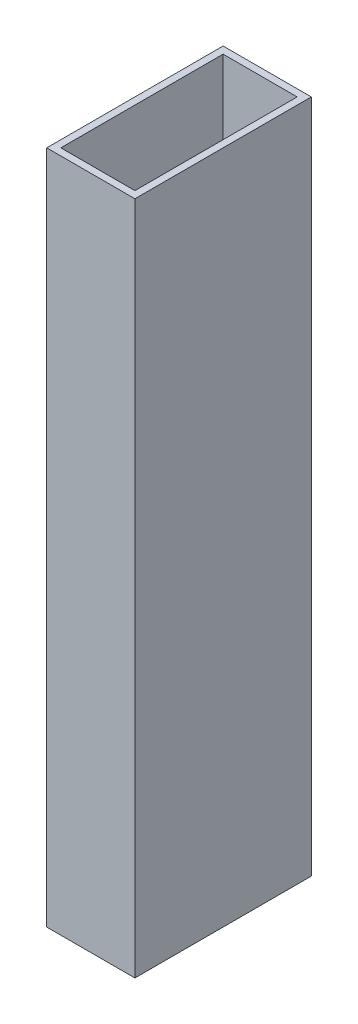
ISO-10303-21;
HEADER;
FILE_DESCRIPTION(('STEP AP214'),'2;1');
FILE_NAME('part.step','',(''),(''),'','','');
FILE_SCHEMA(('AUTOMOTIVE_DESIGN { 1 0 10303 214 1 1 1 1 }'));
ENDSEC;
DATA;
#1=APPLICATION_CONTEXT('core data for automotive mechanical design processes');
#2=APPLICATION_PROTOCOL_DEFINITION('international standard','automotive_design',2000,#1);
#3=PRODUCT_CONTEXT('',#1,'mechanical');
#4=PRODUCT('Part','Part','',(#3));
#5=PRODUCT_RELATED_PRODUCT_CATEGORY('part','',(#4));
#6=PRODUCT_DEFINITION_FORMATION('','',#4);
#7=PRODUCT_DEFINITION_CONTEXT('part definition',#1,'design');
#8=PRODUCT_DEFINITION('design','',#6,#7);
#9=PRODUCT_DEFINITION_SHAPE('','',#8);
#10=(LENGTH_UNIT() NAMED_UNIT(*) SI_UNIT(.MILLI.,.METRE.));
#11=(NAMED_UNIT(*) PLANE_ANGLE_UNIT() SI_UNIT($,.RADIAN.));
#12=(NAMED_UNIT(*) SI_UNIT($,.STERADIAN.) SOLID_ANGLE_UNIT());
#13=UNCERTAINTY_MEASURE_WITH_UNIT(LENGTH_MEASURE(1.E-05),#10,'distance_accuracy_value','');
#14=(GEOMETRIC_REPRESENTATION_CONTEXT(3) GLOBAL_UNCERTAINTY_ASSIGNED_CONTEXT((#13)) GLOBAL_UNIT_ASSIGNED_CONTEXT((#10,
#11,#12)) REPRESENTATION_CONTEXT('',''));
#15=CARTESIAN_POINT('',(0.,0.,0.));
#16=DIRECTION('',(0.,0.,1.));
#17=DIRECTION('',(1.,0.,0.));
#18=AXIS2_PLACEMENT_3D('',#15,#16,#17);
#19=CARTESIAN_POINT('',(281.510652388512,-429.299072168843,-866.486147986318));
#20=DIRECTION('',(-1.,0.,0.));
#21=DIRECTION('',(0.,0.,1.));
#22=AXIS2_PLACEMENT_3D('',#19,#20,#21);
#23=PLANE('',#22);
#24=DIRECTION('',(0.,1.,0.));
#25=VECTOR('',#24,1.);
#26=CARTESIAN_POINT('',(281.510652388512,-429.299072168843,-916.486147986319));
#27=LINE('',#26,#25);
#28=CARTESIAN_POINT('',(281.510652388512,-611.90552333629,-916.486147986319));
#29=VERTEX_POINT('',#28);
#30=CARTESIAN_POINT('',(281.510652388512,-229.299072168843,-916.486147986319));
#31=VERTEX_POINT('',#30);
#32=EDGE_CURVE('E156',#29,#31,#27,.T.);
#33=ORIENTED_EDGE('',*,*,#32,.T.);
#34=DIRECTION('',(0.,0.,-1.));
#35=VECTOR('',#34,1.);
#36=CARTESIAN_POINT('',(281.510652388512,-229.299072168843,-866.486147986318));
#37=LINE('',#36,#35);
#38=CARTESIAN_POINT('',(281.510652388512,-229.299072168843,-816.486147986318));
#39=VERTEX_POINT('',#38);
#40=EDGE_CURVE('E143',#31,#39,#37,.F.);
#41=ORIENTED_EDGE('',*,*,#40,.T.);
#42=DIRECTION('',(0.,1.,0.));
#43=VECTOR('',#42,1.);
#44=CARTESIAN_POINT('',(281.510652388512,-429.299072168843,-816.486147986318));
#45=LINE('',#44,#43);
#46=CARTESIAN_POINT('',(281.510652388512,-611.90552333629,-816.486147986318));
#47=VERTEX_POINT('',#46);
#48=EDGE_CURVE('E91',#47,#39,#45,.T.);
#49=ORIENTED_EDGE('',*,*,#48,.F.);
#50=DIRECTION('',(0.,0.,1.));
#51=VECTOR('',#50,1.);
#52=CARTESIAN_POINT('',(281.510652388512,-611.90552333629,-866.486147986318));
#53=LINE('',#52,#51);
#54=EDGE_CURVE('E108',#47,#29,#53,.F.);
#55=ORIENTED_EDGE('',*,*,#54,.T.);
#56=EDGE_LOOP('',(#33,#41,#49,#55));
#57=FACE_BOUND('',#56,.T.);
#58=ADVANCED_FACE('F17',(#57),#23,.F.);
#59=CARTESIAN_POINT('',(256.510652388512,-429.299072168843,-912.48614798632));
#60=DIRECTION('',(0.,0.,1.));
#61=DIRECTION('',(1.,0.,0.));
#62=AXIS2_PLACEMENT_3D('',#59,#60,#61);
#63=PLANE('',#62);
#64=DIRECTION('',(0.,1.,0.));
#65=VECTOR('',#64,1.);
#66=CARTESIAN_POINT('',(235.510652388511,-429.299072168843,-912.48614798632));
#67=LINE('',#66,#65);
#68=CARTESIAN_POINT('',(235.510652388511,-611.90552333629,-912.48614798632));
#69=VERTEX_POINT('',#68);
#70=CARTESIAN_POINT('',(235.510652388511,-229.299072168843,-912.48614798632));
#71=VERTEX_POINT('',#70);
#72=EDGE_CURVE('E20',#69,#71,#67,.T.);
#73=ORIENTED_EDGE('',*,*,#72,.F.);
#74=DIRECTION('',(1.,0.,0.));
#75=VECTOR('',#74,1.);
#76=CARTESIAN_POINT('',(256.510652388512,-611.90552333629,-912.48614798632));
#77=LINE('',#76,#75);
#78=CARTESIAN_POINT('',(277.510652388512,-611.90552333629,-912.48614798632));
#79=VERTEX_POINT('',#78);
#80=EDGE_CURVE('E99',#69,#79,#77,.T.);
#81=ORIENTED_EDGE('',*,*,#80,.T.);
#82=DIRECTION('',(0.,1.,0.));
#83=VECTOR('',#82,1.);
#84=CARTESIAN_POINT('',(277.510652388512,-429.299072168843,-912.48614798632));
#85=LINE('',#84,#83);
#86=CARTESIAN_POINT('',(277.510652388512,-229.299072168843,-912.48614798632));
#87=VERTEX_POINT('',#86);
#88=EDGE_CURVE('E81',#87,#79,#85,.F.);
#89=ORIENTED_EDGE('',*,*,#88,.F.);
#90=DIRECTION('',(1.,0.,0.));
#91=VECTOR('',#90,1.);
#92=CARTESIAN_POINT('',(256.510652388512,-229.299072168843,-912.48614798632));
#93=LINE('',#92,#91);
#94=EDGE_CURVE('E139',#87,#71,#93,.F.);
#95=ORIENTED_EDGE('',*,*,#94,.T.);
#96=EDGE_LOOP('',(#73,#81,#89,#95));
#97=FACE_BOUND('',#96,.T.);
#98=ADVANCED_FACE('F105',(#97),#63,.T.);
#99=CARTESIAN_POINT('',(235.510652388511,-429.299072168843,-866.486147986318));
#100=DIRECTION('',(1.,0.,0.));
#101=DIRECTION('',(0.,0.,-1.));
#102=AXIS2_PLACEMENT_3D('',#99,#100,#101);
#103=PLANE('',#102);
#104=DIRECTION('',(0.,0.,1.));
#105=VECTOR('',#104,1.);
#106=CARTESIAN_POINT('',(235.510652388511,-611.90552333629,-866.486147986318));
#107=LINE('',#106,#105);
#108=CARTESIAN_POINT('',(235.510652388511,-611.90552333629,-820.486147986319));
#109=VERTEX_POINT('',#108);
#110=EDGE_CURVE('E135',#109,#69,#107,.F.);
#111=ORIENTED_EDGE('',*,*,#110,.T.);
#112=ORIENTED_EDGE('',*,*,#72,.T.);
#113=DIRECTION('',(0.,0.,-1.));
#114=VECTOR('',#113,1.);
#115=CARTESIAN_POINT('',(235.510652388511,-229.299072168843,-866.486147986318));
#116=LINE('',#115,#114);
#117=CARTESIAN_POINT('',(235.510652388511,-229.299072168843,-820.486147986319));
#118=VERTEX_POINT('',#117);
#119=EDGE_CURVE('E134',#71,#118,#116,.F.);
#120=ORIENTED_EDGE('',*,*,#119,.T.);
#121=DIRECTION('',(0.,1.,0.));
#122=VECTOR('',#121,1.);
#123=CARTESIAN_POINT('',(235.510652388511,-429.299072168843,-820.486147986319));
#124=LINE('',#123,#122);
#125=EDGE_CURVE('E124',#118,#109,#124,.F.);
#126=ORIENTED_EDGE('',*,*,#125,.T.);
#127=EDGE_LOOP('',(#111,#112,#120,#126));
#128=FACE_BOUND('',#127,.T.);
#129=ADVANCED_FACE('F133',(#128),#103,.T.);
#130=CARTESIAN_POINT('',(256.510652388512,-429.299072168843,-820.486147986319));
#131=DIRECTION('',(0.,0.,1.));
#132=DIRECTION('',(1.,0.,0.));
#133=AXIS2_PLACEMENT_3D('',#130,#131,#132);
#134=PLANE('',#133);
#135=DIRECTION('',(1.,0.,0.));
#136=VECTOR('',#135,1.);
#137=CARTESIAN_POINT('',(256.510652388512,-611.90552333629,-820.486147986319));
#138=LINE('',#137,#136);
#139=CARTESIAN_POINT('',(277.510652388512,-611.90552333629,-820.486147986319));
#140=VERTEX_POINT('',#139);
#141=EDGE_CURVE('E102',#140,#109,#138,.F.);
#142=ORIENTED_EDGE('',*,*,#141,.T.);
#143=ORIENTED_EDGE('',*,*,#125,.F.);
#144=DIRECTION('',(1.,0.,0.));
#145=VECTOR('',#144,1.);
#146=CARTESIAN_POINT('',(256.510652388512,-229.299072168843,-820.486147986319));
#147=LINE('',#146,#145);
#148=CARTESIAN_POINT('',(277.510652388512,-229.299072168843,-820.486147986319));
#149=VERTEX_POINT('',#148);
#150=EDGE_CURVE('E141',#118,#149,#147,.T.);
#151=ORIENTED_EDGE('',*,*,#150,.T.);
#152=DIRECTION('',(0.,1.,0.));
#153=VECTOR('',#152,1.);
#154=CARTESIAN_POINT('',(277.510652388512,-429.299072168843,-820.486147986319));
#155=LINE('',#154,#153);
#156=EDGE_CURVE('E92',#140,#149,#155,.T.);
#157=ORIENTED_EDGE('',*,*,#156,.F.);
#158=EDGE_LOOP('',(#142,#143,#151,#157));
#159=FACE_BOUND('',#158,.T.);
#160=ADVANCED_FACE('F165',(#159),#134,.F.);
#161=CARTESIAN_POINT('',(277.510652388512,-429.299072168843,-866.486147986318));
#162=DIRECTION('',(-1.,0.,0.));
#163=DIRECTION('',(0.,0.,1.));
#164=AXIS2_PLACEMENT_3D('',#161,#162,#163);
#165=PLANE('',#164);
#166=DIRECTION('',(0.,0.,-1.));
#167=VECTOR('',#166,1.);
#168=CARTESIAN_POINT('',(277.510652388512,-229.299072168843,-866.486147986318));
#169=LINE('',#168,#167);
#170=EDGE_CURVE('E86',#149,#87,#169,.T.);
#171=ORIENTED_EDGE('',*,*,#170,.T.);
#172=ORIENTED_EDGE('',*,*,#88,.T.);
#173=DIRECTION('',(0.,0.,1.));
#174=VECTOR('',#173,1.);
#175=CARTESIAN_POINT('',(277.510652388512,-611.90552333629,-866.486147986318));
#176=LINE('',#175,#174);
#177=EDGE_CURVE('E84',#79,#140,#176,.T.);
#178=ORIENTED_EDGE('',*,*,#177,.T.);
#179=ORIENTED_EDGE('',*,*,#156,.T.);
#180=EDGE_LOOP('',(#171,#172,#178,#179));
#181=FACE_BOUND('',#180,.T.);
#182=ADVANCED_FACE('F83',(#181),#165,.T.);
#183=CARTESIAN_POINT('',(256.510652388512,-429.299072168843,-816.486147986318));
#184=DIRECTION('',(0.,0.,1.));
#185=DIRECTION('',(1.,0.,0.));
#186=AXIS2_PLACEMENT_3D('',#183,#184,#185);
#187=PLANE('',#186);
#188=DIRECTION('',(0.,1.,0.));
#189=VECTOR('',#188,1.);
#190=CARTESIAN_POINT('',(231.510652388511,-429.299072168843,-816.486147986318));
#191=LINE('',#190,#189);
#192=CARTESIAN_POINT('',(231.510652388511,-229.299072168843,-816.486147986318));
#193=VERTEX_POINT('',#192);
#194=CARTESIAN_POINT('',(231.510652388511,-611.90552333629,-816.486147986318));
#195=VERTEX_POINT('',#194);
#196=EDGE_CURVE('E167',#193,#195,#191,.F.);
#197=ORIENTED_EDGE('',*,*,#196,.T.);
#198=DIRECTION('',(1.,0.,0.));
#199=VECTOR('',#198,1.);
#200=CARTESIAN_POINT('',(256.510652388512,-611.90552333629,-816.486147986318));
#201=LINE('',#200,#199);
#202=EDGE_CURVE('E114',#195,#47,#201,.T.);
#203=ORIENTED_EDGE('',*,*,#202,.T.);
#204=ORIENTED_EDGE('',*,*,#48,.T.);
#205=DIRECTION('',(1.,0.,0.));
#206=VECTOR('',#205,1.);
#207=CARTESIAN_POINT('',(256.510652388512,-229.299072168843,-816.486147986318));
#208=LINE('',#207,#206);
#209=EDGE_CURVE('E152',#39,#193,#208,.F.);
#210=ORIENTED_EDGE('',*,*,#209,.T.);
#211=EDGE_LOOP('',(#197,#203,#204,#210));
#212=FACE_BOUND('',#211,.T.);
#213=ADVANCED_FACE('F187',(#212),#187,.T.);
#214=CARTESIAN_POINT('',(256.510652388512,-611.90552333629,-866.486147986318));
#215=DIRECTION('',(0.,1.,0.));
#216=DIRECTION('',(0.,0.,1.));
#217=AXIS2_PLACEMENT_3D('',#214,#215,#216);
#218=PLANE('',#217);
#219=ORIENTED_EDGE('',*,*,#141,.F.);
#220=ORIENTED_EDGE('',*,*,#177,.F.);
#221=ORIENTED_EDGE('',*,*,#80,.F.);
#222=ORIENTED_EDGE('',*,*,#110,.F.);
#223=EDGE_LOOP('',(#219,#220,#221,#222));
#224=FACE_BOUND('',#223,.T.);
#225=DIRECTION('',(1.,0.,0.));
#226=VECTOR('',#225,1.);
#227=CARTESIAN_POINT('',(256.510652388512,-611.90552333629,-916.486147986319));
#228=LINE('',#227,#226);
#229=CARTESIAN_POINT('',(231.510652388511,-611.90552333629,-916.486147986319));
#230=VERTEX_POINT('',#229);
#231=EDGE_CURVE('E159',#230,#29,#228,.T.);
#232=ORIENTED_EDGE('',*,*,#231,.T.);
#233=ORIENTED_EDGE('',*,*,#54,.F.);
#234=ORIENTED_EDGE('',*,*,#202,.F.);
#235=DIRECTION('',(0.,0.,-1.));
#236=VECTOR('',#235,1.);
#237=CARTESIAN_POINT('',(231.510652388511,-611.90552333629,-866.486147986318));
#238=LINE('',#237,#236);
#239=EDGE_CURVE('E171',#195,#230,#238,.T.);
#240=ORIENTED_EDGE('',*,*,#239,.T.);
#241=EDGE_LOOP('',(#232,#233,#234,#240));
#242=FACE_BOUND('',#241,.T.);
#243=ADVANCED_FACE('F96',(#224,#242),#218,.F.);
#244=CARTESIAN_POINT('',(256.510652388512,-429.299072168843,-916.486147986319));
#245=DIRECTION('',(0.,0.,1.));
#246=DIRECTION('',(1.,0.,0.));
#247=AXIS2_PLACEMENT_3D('',#244,#245,#246);
#248=PLANE('',#247);
#249=ORIENTED_EDGE('',*,*,#231,.F.);
#250=DIRECTION('',(0.,1.,0.));
#251=VECTOR('',#250,1.);
#252=CARTESIAN_POINT('',(231.510652388511,-429.299072168843,-916.486147986319));
#253=LINE('',#252,#251);
#254=CARTESIAN_POINT('',(231.510652388511,-229.299072168843,-916.486147986319));
#255=VERTEX_POINT('',#254);
#256=EDGE_CURVE('E27',#230,#255,#253,.T.);
#257=ORIENTED_EDGE('',*,*,#256,.T.);
#258=DIRECTION('',(1.,0.,0.));
#259=VECTOR('',#258,1.);
#260=CARTESIAN_POINT('',(256.510652388512,-229.299072168843,-916.486147986319));
#261=LINE('',#260,#259);
#262=EDGE_CURVE('E35',#255,#31,#261,.T.);
#263=ORIENTED_EDGE('',*,*,#262,.T.);
#264=ORIENTED_EDGE('',*,*,#32,.F.);
#265=EDGE_LOOP('',(#249,#257,#263,#264));
#266=FACE_BOUND('',#265,.T.);
#267=ADVANCED_FACE('F180',(#266),#248,.F.);
#268=CARTESIAN_POINT('',(256.510652388512,-229.299072168843,-866.486147986318));
#269=DIRECTION('',(0.,-1.,0.));
#270=DIRECTION('',(0.,0.,-1.));
#271=AXIS2_PLACEMENT_3D('',#268,#269,#270);
#272=PLANE('',#271);
#273=ORIENTED_EDGE('',*,*,#150,.F.);
#274=ORIENTED_EDGE('',*,*,#119,.F.);
#275=ORIENTED_EDGE('',*,*,#94,.F.);
#276=ORIENTED_EDGE('',*,*,#170,.F.);
#277=EDGE_LOOP('',(#273,#274,#275,#276));
#278=FACE_BOUND('',#277,.T.);
#279=ORIENTED_EDGE('',*,*,#262,.F.);
#280=DIRECTION('',(0.,0.,-1.));
#281=VECTOR('',#280,1.);
#282=CARTESIAN_POINT('',(231.510652388511,-229.299072168843,-866.486147986318));
#283=LINE('',#282,#281);
#284=EDGE_CURVE('E11',#255,#193,#283,.F.);
#285=ORIENTED_EDGE('',*,*,#284,.T.);
#286=ORIENTED_EDGE('',*,*,#209,.F.);
#287=ORIENTED_EDGE('',*,*,#40,.F.);
#288=EDGE_LOOP('',(#279,#285,#286,#287));
#289=FACE_BOUND('',#288,.T.);
#290=ADVANCED_FACE('F138',(#278,#289),#272,.F.);
#291=CARTESIAN_POINT('',(231.510652388511,-429.299072168843,-866.486147986318));
#292=DIRECTION('',(1.,0.,0.));
#293=DIRECTION('',(0.,0.,-1.));
#294=AXIS2_PLACEMENT_3D('',#291,#292,#293);
#295=PLANE('',#294);
#296=ORIENTED_EDGE('',*,*,#256,.F.);
#297=ORIENTED_EDGE('',*,*,#239,.F.);
#298=ORIENTED_EDGE('',*,*,#196,.F.);
#299=ORIENTED_EDGE('',*,*,#284,.F.);
#300=EDGE_LOOP('',(#296,#297,#298,#299));
#301=FACE_BOUND('',#300,.T.);
#302=ADVANCED_FACE('F184',(#301),#295,.F.);
#303=CLOSED_SHELL('',(#58,#98,#129,#160,#182,#213,#243,#267,#290,#302));
#304=MANIFOLD_SOLID_BREP('B1',#303);
#305=ADVANCED_BREP_SHAPE_REPRESENTATION('',(#18,#304),#14);
#306=SHAPE_DEFINITION_REPRESENTATION(#9,#305);
ENDSEC;
END-ISO-10303-21;
